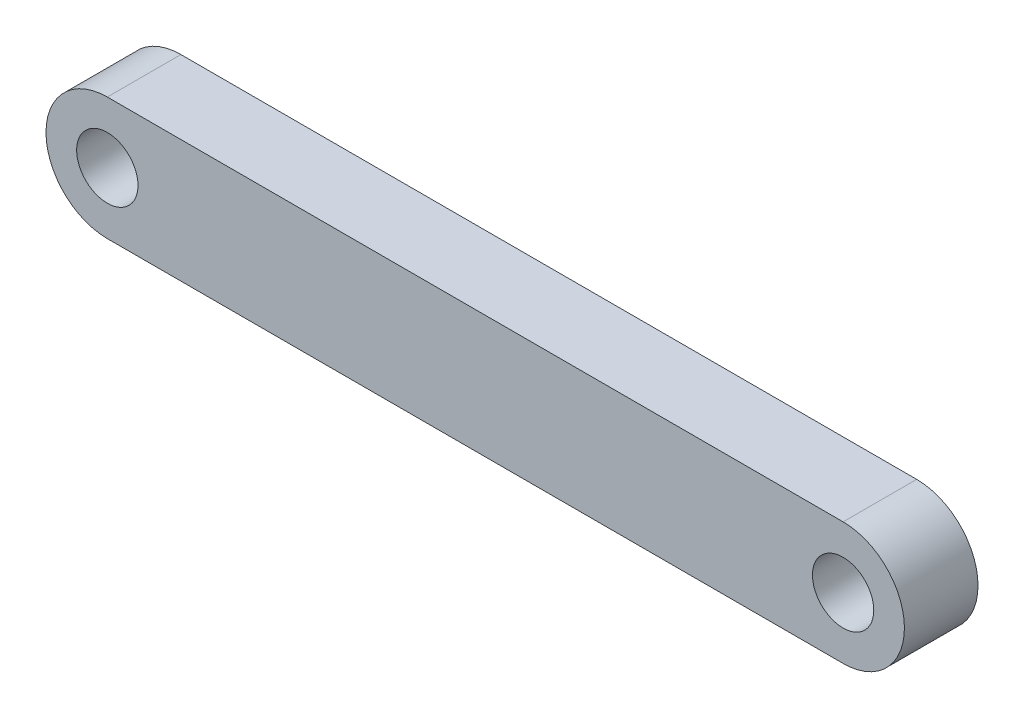
ISO-10303-21;
HEADER;
FILE_DESCRIPTION(('STEP AP214'),'2;1');
FILE_NAME('part.step','',(''),(''),'','','');
FILE_SCHEMA(('AUTOMOTIVE_DESIGN { 1 0 10303 214 1 1 1 1 }'));
ENDSEC;
DATA;
#1=APPLICATION_CONTEXT('core data for automotive mechanical design processes');
#2=APPLICATION_PROTOCOL_DEFINITION('international standard','automotive_design',2000,#1);
#3=PRODUCT_CONTEXT('',#1,'mechanical');
#4=PRODUCT('Part','Part','',(#3));
#5=PRODUCT_RELATED_PRODUCT_CATEGORY('part','',(#4));
#6=PRODUCT_DEFINITION_FORMATION('','',#4);
#7=PRODUCT_DEFINITION_CONTEXT('part definition',#1,'design');
#8=PRODUCT_DEFINITION('design','',#6,#7);
#9=PRODUCT_DEFINITION_SHAPE('','',#8);
#10=(LENGTH_UNIT() NAMED_UNIT(*) SI_UNIT(.MILLI.,.METRE.));
#11=(NAMED_UNIT(*) PLANE_ANGLE_UNIT() SI_UNIT($,.RADIAN.));
#12=(NAMED_UNIT(*) SI_UNIT($,.STERADIAN.) SOLID_ANGLE_UNIT());
#13=UNCERTAINTY_MEASURE_WITH_UNIT(LENGTH_MEASURE(1.E-05),#10,'distance_accuracy_value','');
#14=(GEOMETRIC_REPRESENTATION_CONTEXT(3) GLOBAL_UNCERTAINTY_ASSIGNED_CONTEXT((#13)) GLOBAL_UNIT_ASSIGNED_CONTEXT((#10,
#11,#12)) REPRESENTATION_CONTEXT('',''));
#15=CARTESIAN_POINT('',(0.,0.,0.));
#16=DIRECTION('',(0.,0.,1.));
#17=DIRECTION('',(1.,0.,0.));
#18=AXIS2_PLACEMENT_3D('',#15,#16,#17);
#19=CARTESIAN_POINT('',(0.,-4.99999999999999,3.));
#20=DIRECTION('',(0.,1.,0.));
#21=DIRECTION('',(-1.,0.,0.));
#22=AXIS2_PLACEMENT_3D('',#19,#20,#21);
#23=PLANE('',#22);
#24=DIRECTION('',(1.,0.,0.));
#25=VECTOR('',#24,1.);
#26=CARTESIAN_POINT('',(0.,-4.99999999999999,-3.));
#27=LINE('',#26,#25);
#28=CARTESIAN_POINT('',(-30.,-5.,-3.));
#29=VERTEX_POINT('',#28);
#30=CARTESIAN_POINT('',(30.,-4.99999999999999,-3.));
#31=VERTEX_POINT('',#30);
#32=EDGE_CURVE('E110',#29,#31,#27,.T.);
#33=ORIENTED_EDGE('',*,*,#32,.T.);
#34=DIRECTION('',(0.,0.,-1.));
#35=VECTOR('',#34,1.);
#36=CARTESIAN_POINT('',(30.,-4.99999999999999,3.));
#37=LINE('',#36,#35);
#38=CARTESIAN_POINT('',(30.,-4.99999999999999,3.));
#39=VERTEX_POINT('',#38);
#40=EDGE_CURVE('E11',#39,#31,#37,.T.);
#41=ORIENTED_EDGE('',*,*,#40,.F.);
#42=DIRECTION('',(1.,0.,0.));
#43=VECTOR('',#42,1.);
#44=CARTESIAN_POINT('',(0.,-4.99999999999999,3.));
#45=LINE('',#44,#43);
#46=CARTESIAN_POINT('',(-30.,-5.,3.));
#47=VERTEX_POINT('',#46);
#48=EDGE_CURVE('E89',#47,#39,#45,.T.);
#49=ORIENTED_EDGE('',*,*,#48,.F.);
#50=DIRECTION('',(0.,0.,-1.));
#51=VECTOR('',#50,1.);
#52=CARTESIAN_POINT('',(-30.,-5.,3.));
#53=LINE('',#52,#51);
#54=EDGE_CURVE('E100',#47,#29,#53,.T.);
#55=ORIENTED_EDGE('',*,*,#54,.T.);
#56=EDGE_LOOP('',(#33,#41,#49,#55));
#57=FACE_BOUND('',#56,.T.);
#58=ADVANCED_FACE('F41',(#57),#23,.F.);
#59=CARTESIAN_POINT('',(30.,0.,3.));
#60=DIRECTION('',(0.,0.,-1.));
#61=DIRECTION('',(-1.,0.,0.));
#62=AXIS2_PLACEMENT_3D('',#59,#60,#61);
#63=CYLINDRICAL_SURFACE('',#62,5.);
#64=CARTESIAN_POINT('',(30.,0.,-3.));
#65=DIRECTION('',(0.,0.,1.));
#66=DIRECTION('',(1.,0.,0.));
#67=AXIS2_PLACEMENT_3D('',#64,#65,#66);
#68=CIRCLE('',#67,5.);
#69=CARTESIAN_POINT('',(30.,5.00000000000001,-3.));
#70=VERTEX_POINT('',#69);
#71=EDGE_CURVE('E94',#31,#70,#68,.T.);
#72=ORIENTED_EDGE('',*,*,#71,.T.);
#73=DIRECTION('',(0.,0.,-1.));
#74=VECTOR('',#73,1.);
#75=CARTESIAN_POINT('',(30.,5.00000000000001,3.));
#76=LINE('',#75,#74);
#77=CARTESIAN_POINT('',(30.,5.00000000000001,3.));
#78=VERTEX_POINT('',#77);
#79=EDGE_CURVE('E50',#78,#70,#76,.T.);
#80=ORIENTED_EDGE('',*,*,#79,.F.);
#81=CARTESIAN_POINT('',(30.,0.,3.));
#82=DIRECTION('',(0.,0.,1.));
#83=DIRECTION('',(1.,0.,0.));
#84=AXIS2_PLACEMENT_3D('',#81,#82,#83);
#85=CIRCLE('',#84,5.);
#86=EDGE_CURVE('E84',#39,#78,#85,.T.);
#87=ORIENTED_EDGE('',*,*,#86,.F.);
#88=ORIENTED_EDGE('',*,*,#40,.T.);
#89=EDGE_LOOP('',(#72,#80,#87,#88));
#90=FACE_BOUND('',#89,.T.);
#91=ADVANCED_FACE('F93',(#90),#63,.T.);
#92=CARTESIAN_POINT('',(0.,5.00000000000001,3.));
#93=DIRECTION('',(0.,1.,0.));
#94=DIRECTION('',(-1.,0.,0.));
#95=AXIS2_PLACEMENT_3D('',#92,#93,#94);
#96=PLANE('',#95);
#97=DIRECTION('',(1.,0.,0.));
#98=VECTOR('',#97,1.);
#99=CARTESIAN_POINT('',(0.,5.00000000000001,-3.));
#100=LINE('',#99,#98);
#101=CARTESIAN_POINT('',(-30.,5.,-3.));
#102=VERTEX_POINT('',#101);
#103=EDGE_CURVE('E114',#102,#70,#100,.T.);
#104=ORIENTED_EDGE('',*,*,#103,.F.);
#105=DIRECTION('',(0.,0.,-1.));
#106=VECTOR('',#105,1.);
#107=CARTESIAN_POINT('',(-30.,5.,3.));
#108=LINE('',#107,#106);
#109=CARTESIAN_POINT('',(-30.,5.,3.));
#110=VERTEX_POINT('',#109);
#111=EDGE_CURVE('E74',#110,#102,#108,.T.);
#112=ORIENTED_EDGE('',*,*,#111,.F.);
#113=DIRECTION('',(1.,0.,0.));
#114=VECTOR('',#113,1.);
#115=CARTESIAN_POINT('',(0.,5.00000000000001,3.));
#116=LINE('',#115,#114);
#117=EDGE_CURVE('E87',#110,#78,#116,.T.);
#118=ORIENTED_EDGE('',*,*,#117,.T.);
#119=ORIENTED_EDGE('',*,*,#79,.T.);
#120=EDGE_LOOP('',(#104,#112,#118,#119));
#121=FACE_BOUND('',#120,.T.);
#122=ADVANCED_FACE('F98',(#121),#96,.T.);
#123=CARTESIAN_POINT('',(-30.,0.,3.));
#124=DIRECTION('',(0.,0.,-1.));
#125=DIRECTION('',(-1.,0.,0.));
#126=AXIS2_PLACEMENT_3D('',#123,#124,#125);
#127=CYLINDRICAL_SURFACE('',#126,2.5);
#128=CARTESIAN_POINT('',(-30.,0.,3.));
#129=DIRECTION('',(0.,0.,1.));
#130=DIRECTION('',(1.,0.,0.));
#131=AXIS2_PLACEMENT_3D('',#128,#129,#130);
#132=CIRCLE('',#131,2.5);
#133=CARTESIAN_POINT('',(-27.5,0.,3.));
#134=VERTEX_POINT('',#133);
#135=EDGE_CURVE('E152',#134,#134,#132,.T.);
#136=ORIENTED_EDGE('',*,*,#135,.T.);
#137=EDGE_LOOP('',(#136));
#138=FACE_BOUND('',#137,.T.);
#139=CARTESIAN_POINT('',(-30.,0.,-3.));
#140=DIRECTION('',(0.,0.,1.));
#141=DIRECTION('',(1.,0.,0.));
#142=AXIS2_PLACEMENT_3D('',#139,#140,#141);
#143=CIRCLE('',#142,2.5);
#144=CARTESIAN_POINT('',(-27.5,0.,-3.));
#145=VERTEX_POINT('',#144);
#146=EDGE_CURVE('E107',#145,#145,#143,.T.);
#147=ORIENTED_EDGE('',*,*,#146,.F.);
#148=EDGE_LOOP('',(#147));
#149=FACE_BOUND('',#148,.T.);
#150=ADVANCED_FACE('F141',(#138,#149),#127,.F.);
#151=CARTESIAN_POINT('',(30.,0.,3.));
#152=DIRECTION('',(0.,0.,-1.));
#153=DIRECTION('',(-1.,0.,0.));
#154=AXIS2_PLACEMENT_3D('',#151,#152,#153);
#155=CYLINDRICAL_SURFACE('',#154,2.5);
#156=CARTESIAN_POINT('',(30.,0.,3.));
#157=DIRECTION('',(0.,0.,1.));
#158=DIRECTION('',(1.,0.,0.));
#159=AXIS2_PLACEMENT_3D('',#156,#157,#158);
#160=CIRCLE('',#159,2.5);
#161=CARTESIAN_POINT('',(32.5,0.,3.));
#162=VERTEX_POINT('',#161);
#163=EDGE_CURVE('E117',#162,#162,#160,.T.);
#164=ORIENTED_EDGE('',*,*,#163,.T.);
#165=EDGE_LOOP('',(#164));
#166=FACE_BOUND('',#165,.T.);
#167=CARTESIAN_POINT('',(30.,0.,-3.));
#168=DIRECTION('',(0.,0.,1.));
#169=DIRECTION('',(1.,0.,0.));
#170=AXIS2_PLACEMENT_3D('',#167,#168,#169);
#171=CIRCLE('',#170,2.5);
#172=CARTESIAN_POINT('',(32.5,0.,-3.));
#173=VERTEX_POINT('',#172);
#174=EDGE_CURVE('E104',#173,#173,#171,.T.);
#175=ORIENTED_EDGE('',*,*,#174,.F.);
#176=EDGE_LOOP('',(#175));
#177=FACE_BOUND('',#176,.T.);
#178=ADVANCED_FACE('F43',(#166,#177),#155,.F.);
#179=CARTESIAN_POINT('',(-30.,0.,3.));
#180=DIRECTION('',(0.,0.,-1.));
#181=DIRECTION('',(-1.,0.,0.));
#182=AXIS2_PLACEMENT_3D('',#179,#180,#181);
#183=CYLINDRICAL_SURFACE('',#182,5.);
#184=CARTESIAN_POINT('',(-30.,0.,-3.));
#185=DIRECTION('',(0.,0.,1.));
#186=DIRECTION('',(1.,0.,0.));
#187=AXIS2_PLACEMENT_3D('',#184,#185,#186);
#188=CIRCLE('',#187,5.);
#189=EDGE_CURVE('E77',#102,#29,#188,.T.);
#190=ORIENTED_EDGE('',*,*,#189,.T.);
#191=ORIENTED_EDGE('',*,*,#54,.F.);
#192=CARTESIAN_POINT('',(-30.,0.,3.));
#193=DIRECTION('',(0.,0.,1.));
#194=DIRECTION('',(1.,0.,0.));
#195=AXIS2_PLACEMENT_3D('',#192,#193,#194);
#196=CIRCLE('',#195,5.);
#197=EDGE_CURVE('E58',#110,#47,#196,.T.);
#198=ORIENTED_EDGE('',*,*,#197,.F.);
#199=ORIENTED_EDGE('',*,*,#111,.T.);
#200=EDGE_LOOP('',(#190,#191,#198,#199));
#201=FACE_BOUND('',#200,.T.);
#202=ADVANCED_FACE('F129',(#201),#183,.T.);
#203=CARTESIAN_POINT('',(0.,0.,3.));
#204=DIRECTION('',(0.,0.,1.));
#205=DIRECTION('',(1.,0.,0.));
#206=AXIS2_PLACEMENT_3D('',#203,#204,#205);
#207=PLANE('',#206);
#208=ORIENTED_EDGE('',*,*,#163,.F.);
#209=EDGE_LOOP('',(#208));
#210=FACE_BOUND('',#209,.T.);
#211=ORIENTED_EDGE('',*,*,#135,.F.);
#212=EDGE_LOOP('',(#211));
#213=FACE_BOUND('',#212,.T.);
#214=ORIENTED_EDGE('',*,*,#48,.T.);
#215=ORIENTED_EDGE('',*,*,#86,.T.);
#216=ORIENTED_EDGE('',*,*,#117,.F.);
#217=ORIENTED_EDGE('',*,*,#197,.T.);
#218=EDGE_LOOP('',(#214,#215,#216,#217));
#219=FACE_BOUND('',#218,.T.);
#220=ADVANCED_FACE('F85',(#210,#213,#219),#207,.T.);
#221=CARTESIAN_POINT('',(0.,0.,-3.));
#222=DIRECTION('',(0.,0.,1.));
#223=DIRECTION('',(1.,0.,0.));
#224=AXIS2_PLACEMENT_3D('',#221,#222,#223);
#225=PLANE('',#224);
#226=ORIENTED_EDGE('',*,*,#174,.T.);
#227=EDGE_LOOP('',(#226));
#228=FACE_BOUND('',#227,.T.);
#229=ORIENTED_EDGE('',*,*,#146,.T.);
#230=EDGE_LOOP('',(#229));
#231=FACE_BOUND('',#230,.T.);
#232=ORIENTED_EDGE('',*,*,#32,.F.);
#233=ORIENTED_EDGE('',*,*,#189,.F.);
#234=ORIENTED_EDGE('',*,*,#103,.T.);
#235=ORIENTED_EDGE('',*,*,#71,.F.);
#236=EDGE_LOOP('',(#232,#233,#234,#235));
#237=FACE_BOUND('',#236,.T.);
#238=ADVANCED_FACE('F122',(#228,#231,#237),#225,.F.);
#239=CLOSED_SHELL('',(#58,#91,#122,#150,#178,#202,#220,#238));
#240=MANIFOLD_SOLID_BREP('B2',#239);
#241=ADVANCED_BREP_SHAPE_REPRESENTATION('',(#18,#240),#14);
#242=SHAPE_DEFINITION_REPRESENTATION(#9,#241);
ENDSEC;
END-ISO-10303-21;
